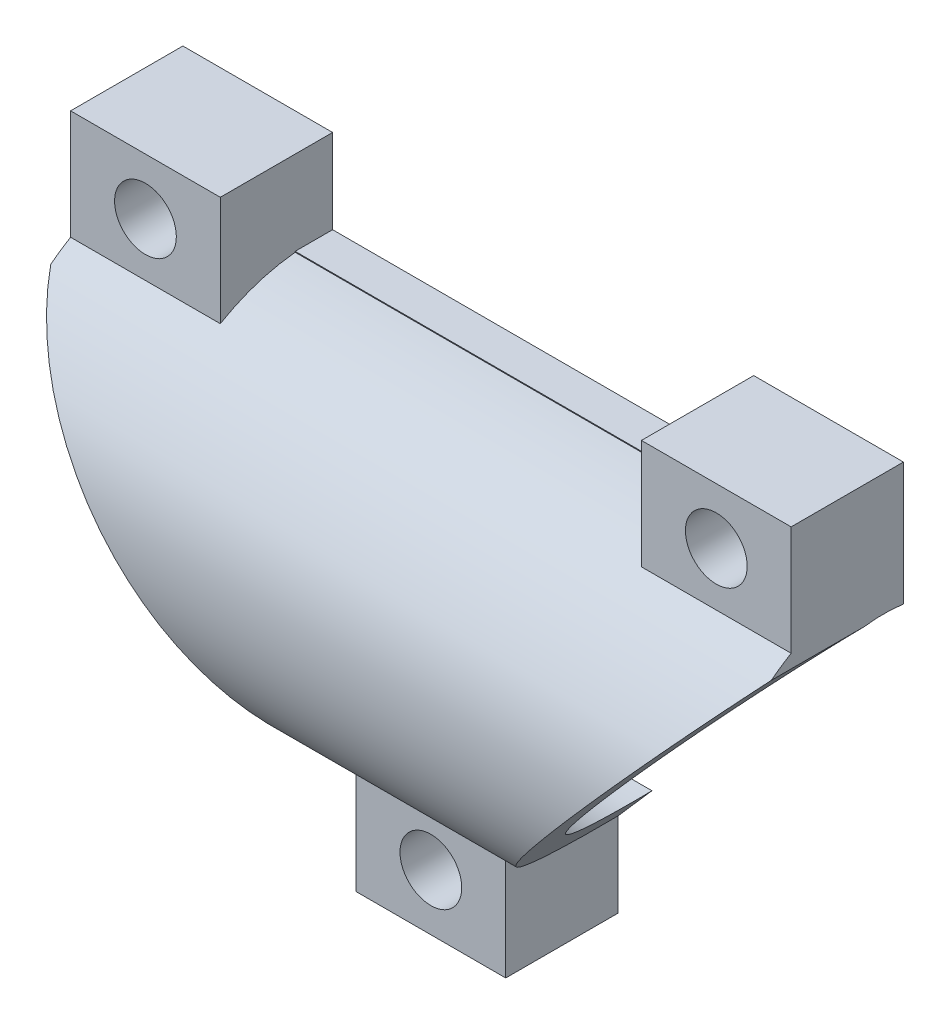
ISO-10303-21;
HEADER;
FILE_DESCRIPTION(('STEP AP214'),'2;1');
FILE_NAME('part.step','',(''),(''),'','','');
FILE_SCHEMA(('AUTOMOTIVE_DESIGN { 1 0 10303 214 1 1 1 1 }'));
ENDSEC;
DATA;
#1=APPLICATION_CONTEXT('core data for automotive mechanical design processes');
#2=APPLICATION_PROTOCOL_DEFINITION('international standard','automotive_design',2000,#1);
#3=PRODUCT_CONTEXT('',#1,'mechanical');
#4=PRODUCT('Part','Part','',(#3));
#5=PRODUCT_RELATED_PRODUCT_CATEGORY('part','',(#4));
#6=PRODUCT_DEFINITION_FORMATION('','',#4);
#7=PRODUCT_DEFINITION_CONTEXT('part definition',#1,'design');
#8=PRODUCT_DEFINITION('design','',#6,#7);
#9=PRODUCT_DEFINITION_SHAPE('','',#8);
#10=(LENGTH_UNIT() NAMED_UNIT(*) SI_UNIT(.MILLI.,.METRE.));
#11=(NAMED_UNIT(*) PLANE_ANGLE_UNIT() SI_UNIT($,.RADIAN.));
#12=(NAMED_UNIT(*) SI_UNIT($,.STERADIAN.) SOLID_ANGLE_UNIT());
#13=UNCERTAINTY_MEASURE_WITH_UNIT(LENGTH_MEASURE(1.E-05),#10,'distance_accuracy_value','');
#14=(GEOMETRIC_REPRESENTATION_CONTEXT(3) GLOBAL_UNCERTAINTY_ASSIGNED_CONTEXT((#13)) GLOBAL_UNIT_ASSIGNED_CONTEXT((#10,
#11,#12)) REPRESENTATION_CONTEXT('',''));
#15=CARTESIAN_POINT('',(0.,0.,0.));
#16=DIRECTION('',(0.,0.,1.));
#17=DIRECTION('',(1.,0.,0.));
#18=AXIS2_PLACEMENT_3D('',#15,#16,#17);
#19=CARTESIAN_POINT('',(37.343313249385,25.7499997086528,1.05000045748869));
#20=DIRECTION('',(-1.,0.,0.));
#21=DIRECTION('',(0.,0.,1.));
#22=AXIS2_PLACEMENT_3D('',#19,#20,#21);
#23=CYLINDRICAL_SURFACE('',#22,9.74999985625085);
#24=CARTESIAN_POINT('',(19.2499998956919,25.7499997086528,1.05000045748869));
#25=DIRECTION('',(-1.,0.,0.));
#26=DIRECTION('',(0.,0.,1.));
#27=AXIS2_PLACEMENT_3D('',#24,#25,#26);
#28=CIRCLE('',#27,9.74999985625085);
#29=CARTESIAN_POINT('',(19.2499998956919,33.4285423159599,7.05853444047162));
#30=VERTEX_POINT('',#29);
#31=CARTESIAN_POINT('',(19.2499998956919,34.1499998113926,6.));
#32=VERTEX_POINT('',#31);
#33=EDGE_CURVE('E382',#30,#32,#28,.T.);
#34=ORIENTED_EDGE('',*,*,#33,.T.);
#35=DIRECTION('',(-1.,0.,0.));
#36=VECTOR('',#35,1.);
#37=CARTESIAN_POINT('',(37.343313249385,34.1499998113926,6.));
#38=LINE('',#37,#36);
#39=CARTESIAN_POINT('',(11.2500004470348,34.1499998113926,6.));
#40=VERTEX_POINT('',#39);
#41=EDGE_CURVE('E48',#32,#40,#38,.T.);
#42=ORIENTED_EDGE('',*,*,#41,.T.);
#43=CARTESIAN_POINT('',(11.2500004470348,25.7499997086528,1.05000045748869));
#44=DIRECTION('',(1.,0.,0.));
#45=DIRECTION('',(0.,0.,-1.));
#46=AXIS2_PLACEMENT_3D('',#43,#44,#45);
#47=CIRCLE('',#46,9.74999985625085);
#48=CARTESIAN_POINT('',(11.2500004470348,35.4536071855719,2.));
#49=VERTEX_POINT('',#48);
#50=EDGE_CURVE('E52',#49,#40,#47,.T.);
#51=ORIENTED_EDGE('',*,*,#50,.F.);
#52=DIRECTION('',(-1.,0.,0.));
#53=VECTOR('',#52,1.);
#54=CARTESIAN_POINT('',(37.343313249385,35.4536071855719,2.));
#55=LINE('',#54,#53);
#56=CARTESIAN_POINT('',(-11.2500004470348,35.4536071855719,2.));
#57=VERTEX_POINT('',#56);
#58=EDGE_CURVE('E299',#49,#57,#55,.T.);
#59=ORIENTED_EDGE('',*,*,#58,.T.);
#60=CARTESIAN_POINT('',(-11.2500004470348,25.7499997086528,1.05000045748869));
#61=DIRECTION('',(-1.,0.,0.));
#62=DIRECTION('',(0.,0.,1.));
#63=AXIS2_PLACEMENT_3D('',#60,#61,#62);
#64=CIRCLE('',#63,9.74999985625085);
#65=CARTESIAN_POINT('',(-11.2500004470348,34.1499998113926,6.));
#66=VERTEX_POINT('',#65);
#67=EDGE_CURVE('E249',#66,#57,#64,.T.);
#68=ORIENTED_EDGE('',*,*,#67,.F.);
#69=DIRECTION('',(-1.,0.,0.));
#70=VECTOR('',#69,1.);
#71=CARTESIAN_POINT('',(37.343313249385,34.1499998113926,6.));
#72=LINE('',#71,#70);
#73=CARTESIAN_POINT('',(-19.2499998956919,34.1499998113926,6.));
#74=VERTEX_POINT('',#73);
#75=EDGE_CURVE('E244',#66,#74,#72,.T.);
#76=ORIENTED_EDGE('',*,*,#75,.T.);
#77=CARTESIAN_POINT('',(-19.2499998956919,25.7499997086528,1.05000045748869));
#78=DIRECTION('',(1.,0.,0.));
#79=DIRECTION('',(0.,0.,-1.));
#80=AXIS2_PLACEMENT_3D('',#77,#78,#79);
#81=CIRCLE('',#80,9.74999985625085);
#82=CARTESIAN_POINT('',(-19.2499998956919,33.4280635697985,7.05914619886155));
#83=VERTEX_POINT('',#82);
#84=EDGE_CURVE('E266',#74,#83,#81,.T.);
#85=ORIENTED_EDGE('',*,*,#84,.T.);
#86=CARTESIAN_POINT('',(-12.53149808052,25.7499997086528,1.05000045748869));
#87=DIRECTION('',(0.752567177216542,0.658515484841721,0.));
#88=DIRECTION('',(0.658515484841721,-0.752567177216542,0.));
#89=AXIS2_PLACEMENT_3D('',#86,#87,#88);
#90=ELLIPSE('',#89,12.9556538624397,9.74999985625085);
#91=CARTESIAN_POINT('',(-4.04059391165742,16.0463922317337,2.));
#92=VERTEX_POINT('',#91);
#93=EDGE_CURVE('E286',#92,#83,#90,.F.);
#94=ORIENTED_EDGE('',*,*,#93,.F.);
#95=DIRECTION('',(-1.,0.,0.));
#96=VECTOR('',#95,1.);
#97=CARTESIAN_POINT('',(37.343313249385,16.0463922317337,2.));
#98=LINE('',#97,#96);
#99=CARTESIAN_POINT('',(-4.00000018998981,16.0463922317337,2.));
#100=VERTEX_POINT('',#99);
#101=EDGE_CURVE('E304',#100,#92,#98,.T.);
#102=ORIENTED_EDGE('',*,*,#101,.F.);
#103=CARTESIAN_POINT('',(-4.00000018998981,25.7499997086528,1.05000045748869));
#104=DIRECTION('',(1.,0.,0.));
#105=DIRECTION('',(0.,0.,-1.));
#106=AXIS2_PLACEMENT_3D('',#103,#104,#105);
#107=CIRCLE('',#106,9.74999985625085);
#108=CARTESIAN_POINT('',(-4.00000018998981,17.349999605913,6.));
#109=VERTEX_POINT('',#108);
#110=EDGE_CURVE('E389',#109,#100,#107,.T.);
#111=ORIENTED_EDGE('',*,*,#110,.F.);
#112=DIRECTION('',(-1.,0.,0.));
#113=VECTOR('',#112,1.);
#114=CARTESIAN_POINT('',(37.343313249385,17.349999605913,6.));
#115=LINE('',#114,#113);
#116=CARTESIAN_POINT('',(4.00000018998981,17.349999605913,6.));
#117=VERTEX_POINT('',#116);
#118=EDGE_CURVE('E41',#109,#117,#115,.F.);
#119=ORIENTED_EDGE('',*,*,#118,.T.);
#120=CARTESIAN_POINT('',(4.00000018998981,25.7499997086528,1.05000045748869));
#121=DIRECTION('',(-1.,0.,0.));
#122=DIRECTION('',(0.,0.,1.));
#123=AXIS2_PLACEMENT_3D('',#120,#121,#122);
#124=CIRCLE('',#123,9.74999985625085);
#125=CARTESIAN_POINT('',(4.00000018998981,16.0463922317337,2.));
#126=VERTEX_POINT('',#125);
#127=EDGE_CURVE('E11',#126,#117,#124,.T.);
#128=ORIENTED_EDGE('',*,*,#127,.F.);
#129=CARTESIAN_POINT('',(4.04059279658486,16.0463922317337,2.));
#130=VERTEX_POINT('',#129);
#131=EDGE_CURVE('E293',#130,#126,#98,.T.);
#132=ORIENTED_EDGE('',*,*,#131,.F.);
#133=CARTESIAN_POINT('',(12.5312637280441,25.7499997086528,1.05000045748869));
#134=DIRECTION('',(-0.752576141659536,0.658505239922088,0.));
#135=DIRECTION('',(-0.658505239922088,-0.752576141659536,0.));
#136=AXIS2_PLACEMENT_3D('',#133,#134,#135);
#137=ELLIPSE('',#136,12.9554995388915,9.74999985625085);
#138=EDGE_CURVE('E292',#130,#30,#137,.T.);
#139=ORIENTED_EDGE('',*,*,#138,.T.);
#140=EDGE_LOOP('',(#34,#42,#51,#59,#68,#76,#85,#94,#102,#111,#119,#128,#132,#139));
#141=FACE_BOUND('',#140,.T.);
#142=ADVANCED_FACE('F33',(#141),#23,.T.);
#143=CARTESIAN_POINT('',(0.,0.,2.));
#144=DIRECTION('',(0.,0.,-1.));
#145=DIRECTION('',(-1.,0.,0.));
#146=AXIS2_PLACEMENT_3D('',#143,#144,#145);
#147=PLANE('',#146);
#148=DIRECTION('',(0.,-1.,0.));
#149=VECTOR('',#148,1.);
#150=CARTESIAN_POINT('',(11.2500004470348,39.9999991059303,2.));
#151=LINE('',#150,#149);
#152=CARTESIAN_POINT('',(11.2500004470348,35.5000011622906,2.));
#153=VERTEX_POINT('',#152);
#154=EDGE_CURVE('E214',#153,#49,#151,.T.);
#155=ORIENTED_EDGE('',*,*,#154,.F.);
#156=DIRECTION('',(-1.,0.,0.));
#157=VECTOR('',#156,1.);
#158=CARTESIAN_POINT('',(11.2500004470348,35.5000011622906,2.));
#159=LINE('',#158,#157);
#160=CARTESIAN_POINT('',(-11.2500004470348,35.5000011622906,2.));
#161=VERTEX_POINT('',#160);
#162=EDGE_CURVE('E329',#153,#161,#159,.T.);
#163=ORIENTED_EDGE('',*,*,#162,.T.);
#164=DIRECTION('',(0.,1.,0.));
#165=VECTOR('',#164,1.);
#166=CARTESIAN_POINT('',(-11.2500004470348,39.9999991059303,2.));
#167=LINE('',#166,#165);
#168=EDGE_CURVE('E246',#57,#161,#167,.T.);
#169=ORIENTED_EDGE('',*,*,#168,.F.);
#170=ORIENTED_EDGE('',*,*,#58,.F.);
#171=EDGE_LOOP('',(#155,#163,#169,#170));
#172=FACE_BOUND('',#171,.T.);
#173=ADVANCED_FACE('F414',(#172),#147,.F.);
#174=CARTESIAN_POINT('',(15.8254704476873,35.4536071855719,2.));
#175=VERTEX_POINT('',#174);
#176=CARTESIAN_POINT('',(14.6745273094585,35.4536071855719,2.));
#177=VERTEX_POINT('',#176);
#178=EDGE_CURVE('E300',#175,#177,#55,.T.);
#179=ORIENTED_EDGE('',*,*,#178,.T.);
#180=CARTESIAN_POINT('',(14.6745273094585,35.4536071855719,2.));
#181=CARTESIAN_POINT('',(14.6890869193746,35.4482353639984,2.05497857071875));
#182=CARTESIAN_POINT('',(14.7052699945459,35.4424044633526,2.10961388611764));
#183=CARTESIAN_POINT('',(14.7424330877981,35.4298693754148,2.21860863914415));
#184=CARTESIAN_POINT('',(14.7635200995631,35.4231474127118,2.27292912308935));
#185=CARTESIAN_POINT('',(14.8115325915728,35.4091295544325,2.37913638152385));
#186=CARTESIAN_POINT('',(14.8384790305994,35.4018316600828,2.4310135844776));
#187=CARTESIAN_POINT('',(14.9001365528176,35.3872044383898,2.52959112685936));
#188=CARTESIAN_POINT('',(14.9347603772952,35.3798763075888,2.57634145054614));
#189=CARTESIAN_POINT('',(14.9894105139679,35.3706440791198,2.63301801505737));
#190=CARTESIAN_POINT('',(15.0046732050333,35.3682601192811,2.64742137543305));
#191=CARTESIAN_POINT('',(15.0368475830146,35.363744945726,2.67437213859106));
#192=CARTESIAN_POINT('',(15.0537609441431,35.3616139935834,2.68691762385244));
#193=CARTESIAN_POINT('',(15.089493952645,35.3577265449485,2.70958381325525));
#194=CARTESIAN_POINT('',(15.108333379187,35.3559746626832,2.71967480560363));
#195=CARTESIAN_POINT('',(15.1475582701478,35.3530674054866,2.73631615995588));
#196=CARTESIAN_POINT('',(15.1679397208053,35.3519105391594,2.74287537624275));
#197=CARTESIAN_POINT('',(15.204926103075,35.3505371496644,2.7506443950677));
#198=CARTESIAN_POINT('',(15.2213415005125,35.3501670419555,2.75272903255858));
#199=CARTESIAN_POINT('',(15.2542928049548,35.3499241328895,2.75409816267267));
#200=CARTESIAN_POINT('',(15.2708286713276,35.350051170961,2.75338355941361));
#201=CARTESIAN_POINT('',(15.3034946928646,35.3507871871223,2.74922999291914));
#202=CARTESIAN_POINT('',(15.3196257233044,35.3513950125314,2.74579754565613));
#203=CARTESIAN_POINT('',(15.3511522738661,35.3530282597933,2.73652404962179));
#204=CARTESIAN_POINT('',(15.3665472309216,35.3540539957959,2.73068118886449));
#205=CARTESIAN_POINT('',(15.4033372354835,35.3569945167403,2.71380637878747));
#206=CARTESIAN_POINT('',(15.4241871216667,35.3591008689789,2.70162506826086));
#207=CARTESIAN_POINT('',(15.4636903406001,35.3637751915386,2.67419671624534));
#208=CARTESIAN_POINT('',(15.4823383288106,35.3663442483119,2.65894244909774));
#209=CARTESIAN_POINT('',(15.5301200857362,35.3736647363941,2.61472356264629));
#210=CARTESIAN_POINT('',(15.5573007250368,35.3786708135981,2.58371306789918));
#211=CARTESIAN_POINT('',(15.6070712551038,35.3888998986343,2.51806821788299));
#212=CARTESIAN_POINT('',(15.6296278373143,35.3941241749943,2.48341011687443));
#213=CARTESIAN_POINT('',(15.6707385864821,35.4044070138463,2.41241991648163));
#214=CARTESIAN_POINT('',(15.6893412901131,35.4094668504486,2.3761156759667));
#215=CARTESIAN_POINT('',(15.7236421608923,35.4193425670659,2.3020808823343));
#216=CARTESIAN_POINT('',(15.739335649073,35.4241580451939,2.26434814709082));
#217=CARTESIAN_POINT('',(15.7678457523684,35.4332993497926,2.18912062181814));
#218=CARTESIAN_POINT('',(15.7807365677551,35.4376357376829,2.15165482568203));
#219=CARTESIAN_POINT('',(15.8045103240348,35.4459196077647,2.07619672380728));
#220=CARTESIAN_POINT('',(15.8154003628682,35.449868440663,2.03820681431734));
#221=CARTESIAN_POINT('',(15.8254704476873,35.4536071855719,2.));
#222=B_SPLINE_CURVE_WITH_KNOTS('',3,(#180,#181,#182,#183,#184,#185,#186,#187,#188,#189,#190,
#191,#192,#193,#194,#195,#196,#197,#198,#199,#200,#201,#202,#203,#204,#205,#206,#207,#208,#209,
#210,#211,#212,#213,#214,#215,#216,#217,#218,#219,#220,#221),.UNSPECIFIED.,.F.,.F.,(4,2,2,2,2,2,
2,2,2,2,2,2,2,2,2,2,2,2,2,2,4),(0.,0.171556884118197,0.347281912473263,0.523646151863211,
0.698100216558771,0.761350463593841,0.824665543201889,0.888712657656493,0.952598447227425,
1.00202228833746,1.05143016751675,1.10071994972591,1.15004685237581,1.22234883758516,
1.29482285870243,1.41874247962986,1.54352558539148,1.66667491143804,1.7900206152079,
1.90953620828261,2.0286192572141),.UNSPECIFIED.);
#223=EDGE_CURVE('E209',#177,#175,#222,.T.);
#224=ORIENTED_EDGE('',*,*,#223,.T.);
#225=EDGE_LOOP('',(#179,#224));
#226=FACE_BOUND('',#225,.T.);
#227=ADVANCED_FACE('F415',(#226),#23,.T.);
#228=DIRECTION('',(0.,1.,0.));
#229=VECTOR('',#228,1.);
#230=CARTESIAN_POINT('',(4.00000018998981,11.5000000223517,2.));
#231=LINE('',#230,#229);
#232=CARTESIAN_POINT('',(4.00000018998981,16.0000007599592,2.));
#233=VERTEX_POINT('',#232);
#234=EDGE_CURVE('E255',#233,#126,#231,.T.);
#235=ORIENTED_EDGE('',*,*,#234,.F.);
#236=DIRECTION('',(0.658505239922087,0.752576141659536,0.));
#237=VECTOR('',#236,1.);
#238=CARTESIAN_POINT('',(19.2499998956919,33.4285423159599,2.));
#239=LINE('',#238,#237);
#240=EDGE_CURVE('E325',#233,#130,#239,.T.);
#241=ORIENTED_EDGE('',*,*,#240,.T.);
#242=ORIENTED_EDGE('',*,*,#131,.T.);
#243=EDGE_LOOP('',(#235,#241,#242));
#244=FACE_BOUND('',#243,.T.);
#245=ADVANCED_FACE('F422',(#244),#147,.F.);
#246=DIRECTION('',(0.,-1.,0.));
#247=VECTOR('',#246,1.);
#248=CARTESIAN_POINT('',(-4.00000018998981,11.5000000223517,2.));
#249=LINE('',#248,#247);
#250=CARTESIAN_POINT('',(-4.00000018998981,16.0000007599592,2.));
#251=VERTEX_POINT('',#250);
#252=EDGE_CURVE('E260',#100,#251,#249,.T.);
#253=ORIENTED_EDGE('',*,*,#252,.F.);
#254=ORIENTED_EDGE('',*,*,#101,.T.);
#255=DIRECTION('',(0.658515484841721,-0.752567177216542,0.));
#256=VECTOR('',#255,1.);
#257=CARTESIAN_POINT('',(-19.2499998956919,33.4280635697985,2.));
#258=LINE('',#257,#256);
#259=EDGE_CURVE('E323',#92,#251,#258,.T.);
#260=ORIENTED_EDGE('',*,*,#259,.T.);
#261=EDGE_LOOP('',(#253,#254,#260));
#262=FACE_BOUND('',#261,.T.);
#263=ADVANCED_FACE('F421',(#262),#147,.F.);
#264=CARTESIAN_POINT('',(-14.6745279139533,35.4536071855719,2.));
#265=VERTEX_POINT('',#264);
#266=CARTESIAN_POINT('',(-15.8254710919479,35.4536071855719,2.));
#267=VERTEX_POINT('',#266);
#268=EDGE_CURVE('E289',#265,#267,#55,.T.);
#269=ORIENTED_EDGE('',*,*,#268,.T.);
#270=CARTESIAN_POINT('',(-15.8254710919479,35.4536071855719,2.));
#271=CARTESIAN_POINT('',(-15.8109114806375,35.4482353633008,2.05497857789963));
#272=CARTESIAN_POINT('',(-15.7947284037572,35.4424044618253,2.10961390046263));
#273=CARTESIAN_POINT('',(-15.7575653057898,35.429869371933,2.2186086683485));
#274=CARTESIAN_POINT('',(-15.7364782909346,35.4231474080908,2.27292915995856));
#275=CARTESIAN_POINT('',(-15.6884657910858,35.4091295473877,2.379136433025));
#276=CARTESIAN_POINT('',(-15.6615193472958,35.4018316517522,2.431013642939));
#277=CARTESIAN_POINT('',(-15.5998618130471,35.3872044276299,2.52959119712543));
#278=CARTESIAN_POINT('',(-15.5652379813819,35.3798762956855,2.57634152570385));
#279=CARTESIAN_POINT('',(-15.5105878350755,35.3706440667171,2.63301809041545));
#280=CARTESIAN_POINT('',(-15.4953251435036,35.3682601071184,2.64742144864683));
#281=CARTESIAN_POINT('',(-15.4631507646186,35.3637449341175,2.6743722072757));
#282=CARTESIAN_POINT('',(-15.4462374030931,35.3616139822891,2.68691769015237));
#283=CARTESIAN_POINT('',(-15.4105043940266,35.3577265343636,2.70958387451583));
#284=CARTESIAN_POINT('',(-15.3916649673196,35.3559746524947,2.71967486420649));
#285=CARTESIAN_POINT('',(-15.3524400764702,35.3530673961503,2.73631621310952));
#286=CARTESIAN_POINT('',(-15.3320586260873,35.3519105302793,2.74287542660369));
#287=CARTESIAN_POINT('',(-15.2950722436461,35.3505371415456,2.75064444089647));
#288=CARTESIAN_POINT('',(-15.2786568455997,35.3501670341765,2.75272907641642));
#289=CARTESIAN_POINT('',(-15.2457055402925,35.3499241258203,2.75409820249579));
#290=CARTESIAN_POINT('',(-15.2291696736636,35.3500511642619,2.75338359717154));
#291=CARTESIAN_POINT('',(-15.1965036520055,35.3507871811497,2.74923002666758));
#292=CARTESIAN_POINT('',(-15.1803726216988,35.3513950069135,2.7457975774689));
#293=CARTESIAN_POINT('',(-15.1488460716281,35.3530282548425,2.73652407781704));
#294=CARTESIAN_POINT('',(-15.1334511149305,35.3540539911572,2.73068121537846));
#295=CARTESIAN_POINT('',(-15.0966611084379,35.356994513043,2.71380640015804));
#296=CARTESIAN_POINT('',(-15.075811220299,35.3591008659778,2.70162508575457));
#297=CARTESIAN_POINT('',(-15.0363079980231,35.3637751899307,2.6741967257976));
#298=CARTESIAN_POINT('',(-15.0176600084291,35.3663442474016,2.65894245458245));
#299=CARTESIAN_POINT('',(-14.9698782462994,35.3736647376266,2.61472355522571));
#300=CARTESIAN_POINT('',(-14.9426976039499,35.3786708162901,2.58371305120111));
#301=CARTESIAN_POINT('',(-14.892927069006,35.3888999040725,2.51806818239576));
#302=CARTESIAN_POINT('',(-14.8703704849685,35.3941241817176,2.48341007187932));
#303=CARTESIAN_POINT('',(-14.8292597403943,35.4044070210549,2.41241986531173));
#304=CARTESIAN_POINT('',(-14.8106570418556,35.4094668568947,2.37611562888716));
#305=CARTESIAN_POINT('',(-14.776356179987,35.4193425719786,2.30208084425702));
#306=CARTESIAN_POINT('',(-14.7606626956182,35.4241580493358,2.26434811392872));
#307=CARTESIAN_POINT('',(-14.7321525986648,35.4332993525501,2.18912059823125));
#308=CARTESIAN_POINT('',(-14.7192617858716,35.4376357398198,2.15165480672803));
#309=CARTESIAN_POINT('',(-14.695488034066,35.4459196087585,2.07619671424183));
#310=CARTESIAN_POINT('',(-14.6845979971219,35.4498684411329,2.03820680950446));
#311=CARTESIAN_POINT('',(-14.6745279139533,35.4536071855719,2.));
#312=B_SPLINE_CURVE_WITH_KNOTS('',3,(#270,#271,#272,#273,#274,#275,#276,#277,#278,#279,#280,
#281,#282,#283,#284,#285,#286,#287,#288,#289,#290,#291,#292,#293,#294,#295,#296,#297,#298,#299,
#300,#301,#302,#303,#304,#305,#306,#307,#308,#309,#310,#311),.UNSPECIFIED.,.F.,.F.,(4,2,2,2,2,2,
2,2,2,2,2,2,2,2,2,2,2,2,2,2,4),(0.,0.171556906210703,0.347281959483287,0.523646224140955,
0.698100312736243,0.761350556381208,0.824665632582758,0.888712743597544,0.952598529765746,
1.00202237189821,1.05143025212526,1.10072003521839,1.15004693874504,1.22234893495675,
1.29482296716301,1.41874261523071,1.54352574812807,1.66667505630267,1.79002074198567,
1.90953631931055,2.02861935293385),.UNSPECIFIED.);
#313=EDGE_CURVE('E238',#267,#265,#312,.T.);
#314=ORIENTED_EDGE('',*,*,#313,.T.);
#315=EDGE_LOOP('',(#269,#314));
#316=FACE_BOUND('',#315,.T.);
#317=ADVANCED_FACE('F425',(#316),#23,.T.);
#318=CARTESIAN_POINT('',(0.,0.,0.));
#319=DIRECTION('',(0.,0.,-1.));
#320=DIRECTION('',(-1.,0.,0.));
#321=AXIS2_PLACEMENT_3D('',#318,#319,#320);
#322=PLANE('',#321);
#323=DIRECTION('',(1.,0.,0.));
#324=VECTOR('',#323,1.);
#325=CARTESIAN_POINT('',(-61.2500004470348,33.4285410291877,0.));
#326=LINE('',#325,#324);
#327=CARTESIAN_POINT('',(-19.2499998956919,33.4285410291877,0.));
#328=VERTEX_POINT('',#327);
#329=CARTESIAN_POINT('',(19.2499998956919,33.4285423159599,0.));
#330=VERTEX_POINT('',#329);
#331=EDGE_CURVE('E277',#328,#330,#326,.T.);
#332=ORIENTED_EDGE('',*,*,#331,.F.);
#333=DIRECTION('',(0.,-1.,0.));
#334=VECTOR('',#333,1.);
#335=CARTESIAN_POINT('',(-19.2499998956919,35.5000011622906,0.));
#336=LINE('',#335,#334);
#337=CARTESIAN_POINT('',(-19.2499998956919,39.9999991059303,0.));
#338=VERTEX_POINT('',#337);
#339=EDGE_CURVE('E320',#338,#328,#336,.T.);
#340=ORIENTED_EDGE('',*,*,#339,.F.);
#341=DIRECTION('',(-1.,0.,0.));
#342=VECTOR('',#341,1.);
#343=CARTESIAN_POINT('',(-19.2499998956919,39.9999991059303,0.));
#344=LINE('',#343,#342);
#345=CARTESIAN_POINT('',(-11.2500004470348,39.9999991059303,0.));
#346=VERTEX_POINT('',#345);
#347=EDGE_CURVE('E326',#346,#338,#344,.T.);
#348=ORIENTED_EDGE('',*,*,#347,.F.);
#349=DIRECTION('',(0.,1.,0.));
#350=VECTOR('',#349,1.);
#351=CARTESIAN_POINT('',(-11.2500004470348,39.9999991059303,0.));
#352=LINE('',#351,#350);
#353=CARTESIAN_POINT('',(-11.2500004470348,35.5000011622906,0.));
#354=VERTEX_POINT('',#353);
#355=EDGE_CURVE('E352',#354,#346,#352,.T.);
#356=ORIENTED_EDGE('',*,*,#355,.F.);
#357=DIRECTION('',(-1.,0.,0.));
#358=VECTOR('',#357,1.);
#359=CARTESIAN_POINT('',(11.2500004470348,35.5000011622906,0.));
#360=LINE('',#359,#358);
#361=CARTESIAN_POINT('',(11.2500004470348,35.5000011622906,0.));
#362=VERTEX_POINT('',#361);
#363=EDGE_CURVE('E350',#362,#354,#360,.T.);
#364=ORIENTED_EDGE('',*,*,#363,.F.);
#365=DIRECTION('',(0.,-1.,0.));
#366=VECTOR('',#365,1.);
#367=CARTESIAN_POINT('',(11.2500004470348,39.9999991059303,0.));
#368=LINE('',#367,#366);
#369=CARTESIAN_POINT('',(11.2500004470348,39.9999991059303,0.));
#370=VERTEX_POINT('',#369);
#371=EDGE_CURVE('E348',#370,#362,#368,.T.);
#372=ORIENTED_EDGE('',*,*,#371,.F.);
#373=DIRECTION('',(-1.,0.,0.));
#374=VECTOR('',#373,1.);
#375=CARTESIAN_POINT('',(19.2499998956919,39.9999991059303,0.));
#376=LINE('',#375,#374);
#377=CARTESIAN_POINT('',(19.2499998956919,39.9999991059303,0.));
#378=VERTEX_POINT('',#377);
#379=EDGE_CURVE('E346',#378,#370,#376,.T.);
#380=ORIENTED_EDGE('',*,*,#379,.F.);
#381=DIRECTION('',(0.,1.,0.));
#382=VECTOR('',#381,1.);
#383=CARTESIAN_POINT('',(19.2499998956919,39.9999991059303,0.));
#384=LINE('',#383,#382);
#385=EDGE_CURVE('E192',#330,#378,#384,.T.);
#386=ORIENTED_EDGE('',*,*,#385,.F.);
#387=EDGE_LOOP('',(#332,#340,#348,#356,#364,#372,#380,#386));
#388=FACE_BOUND('',#387,.T.);
#389=CARTESIAN_POINT('',(-15.2499995029506,37.0000014711159,0.));
#390=DIRECTION('',(0.,0.,1.));
#391=DIRECTION('',(1.,0.,0.));
#392=AXIS2_PLACEMENT_3D('',#389,#390,#391);
#393=CIRCLE('',#392,1.65000085942588);
#394=CARTESIAN_POINT('',(-13.5999986435247,37.0000014711159,0.));
#395=VERTEX_POINT('',#394);
#396=EDGE_CURVE('E314',#395,#395,#393,.T.);
#397=ORIENTED_EDGE('',*,*,#396,.T.);
#398=EDGE_LOOP('',(#397));
#399=FACE_BOUND('',#398,.T.);
#400=CARTESIAN_POINT('',(15.2499988785729,37.0000014746957,0.));
#401=DIRECTION('',(0.,0.,1.));
#402=DIRECTION('',(1.,0.,0.));
#403=AXIS2_PLACEMENT_3D('',#400,#401,#402);
#404=CIRCLE('',#403,1.65000085584639);
#405=CARTESIAN_POINT('',(16.8999997344193,37.0000014746957,0.));
#406=VERTEX_POINT('',#405);
#407=EDGE_CURVE('E308',#406,#406,#404,.T.);
#408=ORIENTED_EDGE('',*,*,#407,.T.);
#409=EDGE_LOOP('',(#408));
#410=FACE_BOUND('',#409,.T.);
#411=ADVANCED_FACE('F432',(#388,#399,#410),#322,.T.);
#412=DIRECTION('',(1.,0.,0.));
#413=VECTOR('',#412,1.);
#414=CARTESIAN_POINT('',(-61.2500004470348,18.0714583881179,0.));
#415=LINE('',#414,#413);
#416=CARTESIAN_POINT('',(5.8125286863239,18.0714583881179,0.));
#417=VERTEX_POINT('',#416);
#418=CARTESIAN_POINT('',(-5.81257847619841,18.0714583881179,0.));
#419=VERTEX_POINT('',#418);
#420=EDGE_CURVE('E284',#417,#419,#415,.F.);
#421=ORIENTED_EDGE('',*,*,#420,.F.);
#422=DIRECTION('',(0.658505239922087,0.752576141659536,0.));
#423=VECTOR('',#422,1.);
#424=CARTESIAN_POINT('',(19.2499998956919,33.4285423159599,0.));
#425=LINE('',#424,#423);
#426=CARTESIAN_POINT('',(4.00000018998981,16.0000007599592,0.));
#427=VERTEX_POINT('',#426);
#428=EDGE_CURVE('E342',#427,#417,#425,.T.);
#429=ORIENTED_EDGE('',*,*,#428,.F.);
#430=DIRECTION('',(0.,1.,0.));
#431=VECTOR('',#430,1.);
#432=CARTESIAN_POINT('',(4.00000018998981,11.5000000223517,0.));
#433=LINE('',#432,#431);
#434=CARTESIAN_POINT('',(4.00000018998981,11.5000000223517,0.));
#435=VERTEX_POINT('',#434);
#436=EDGE_CURVE('E340',#435,#427,#433,.T.);
#437=ORIENTED_EDGE('',*,*,#436,.F.);
#438=DIRECTION('',(1.,0.,0.));
#439=VECTOR('',#438,1.);
#440=CARTESIAN_POINT('',(4.00000018998981,11.5000000223517,0.));
#441=LINE('',#440,#439);
#442=CARTESIAN_POINT('',(-4.00000018998981,11.5000000223517,0.));
#443=VERTEX_POINT('',#442);
#444=EDGE_CURVE('E338',#443,#435,#441,.T.);
#445=ORIENTED_EDGE('',*,*,#444,.F.);
#446=DIRECTION('',(0.,-1.,0.));
#447=VECTOR('',#446,1.);
#448=CARTESIAN_POINT('',(-4.00000018998981,11.5000000223517,0.));
#449=LINE('',#448,#447);
#450=CARTESIAN_POINT('',(-4.00000018998981,16.0000007599592,0.));
#451=VERTEX_POINT('',#450);
#452=EDGE_CURVE('E336',#451,#443,#449,.T.);
#453=ORIENTED_EDGE('',*,*,#452,.F.);
#454=DIRECTION('',(0.658515484841721,-0.752567177216542,0.));
#455=VECTOR('',#454,1.);
#456=CARTESIAN_POINT('',(-19.2499998956919,33.4280635697985,0.));
#457=LINE('',#456,#455);
#458=EDGE_CURVE('E334',#419,#451,#457,.T.);
#459=ORIENTED_EDGE('',*,*,#458,.F.);
#460=EDGE_LOOP('',(#421,#429,#437,#445,#453,#459));
#461=FACE_BOUND('',#460,.T.);
#462=CARTESIAN_POINT('',(1.86598644064687E-07,14.4999997791263,0.));
#463=DIRECTION('',(0.,0.,1.));
#464=DIRECTION('',(1.,0.,0.));
#465=AXIS2_PLACEMENT_3D('',#462,#463,#464);
#466=CIRCLE('',#465,1.64999979470053);
#467=CARTESIAN_POINT('',(1.64999998129917,14.4999997791263,0.));
#468=VERTEX_POINT('',#467);
#469=EDGE_CURVE('E296',#468,#468,#466,.T.);
#470=ORIENTED_EDGE('',*,*,#469,.T.);
#471=EDGE_LOOP('',(#470));
#472=FACE_BOUND('',#471,.T.);
#473=ADVANCED_FACE('F438',(#461,#472),#322,.T.);
#474=CARTESIAN_POINT('',(-19.2499998956919,35.5000011622906,2.));
#475=DIRECTION('',(1.,0.,0.));
#476=DIRECTION('',(0.,1.,0.));
#477=AXIS2_PLACEMENT_3D('',#474,#475,#476);
#478=PLANE('',#477);
#479=ORIENTED_EDGE('',*,*,#84,.F.);
#480=DIRECTION('',(0.,-1.,0.));
#481=VECTOR('',#480,1.);
#482=CARTESIAN_POINT('',(-19.2499998956919,39.9999991059303,6.));
#483=LINE('',#482,#481);
#484=CARTESIAN_POINT('',(-19.2499998956919,39.9999991059303,6.));
#485=VERTEX_POINT('',#484);
#486=EDGE_CURVE('E459',#485,#74,#483,.T.);
#487=ORIENTED_EDGE('',*,*,#486,.F.);
#488=DIRECTION('',(0.,0.,-1.));
#489=VECTOR('',#488,1.);
#490=CARTESIAN_POINT('',(-19.2499998956919,39.9999991059303,2.));
#491=LINE('',#490,#489);
#492=EDGE_CURVE('E331',#485,#338,#491,.T.);
#493=ORIENTED_EDGE('',*,*,#492,.T.);
#494=ORIENTED_EDGE('',*,*,#339,.T.);
#495=CARTESIAN_POINT('',(-19.2499998956919,25.7499997086528,1.05000045748869));
#496=DIRECTION('',(1.,0.,0.));
#497=DIRECTION('',(0.,1.,0.));
#498=AXIS2_PLACEMENT_3D('',#495,#496,#497);
#499=CIRCLE('',#498,7.74999985625085);
#500=CARTESIAN_POINT('',(-19.2499998956919,33.4280635697985,2.10348663018204));
#501=VERTEX_POINT('',#500);
#502=EDGE_CURVE('E275',#328,#501,#499,.T.);
#503=ORIENTED_EDGE('',*,*,#502,.T.);
#504=DIRECTION('',(0.,0.,-1.));
#505=VECTOR('',#504,1.);
#506=CARTESIAN_POINT('',(-19.2499998956919,33.4280635697985,2.));
#507=LINE('',#506,#505);
#508=EDGE_CURVE('E379',#83,#501,#507,.T.);
#509=ORIENTED_EDGE('',*,*,#508,.F.);
#510=EDGE_LOOP('',(#479,#487,#493,#494,#503,#509));
#511=FACE_BOUND('',#510,.T.);
#512=ADVANCED_FACE('F35',(#511),#478,.F.);
#513=CARTESIAN_POINT('',(-19.2499998956919,33.4280635697985,2.));
#514=DIRECTION('',(0.752567177216542,0.658515484841721,0.));
#515=DIRECTION('',(-0.658515484841721,0.752567177216542,0.));
#516=AXIS2_PLACEMENT_3D('',#513,#514,#515);
#517=PLANE('',#516);
#518=ORIENTED_EDGE('',*,*,#259,.F.);
#519=ORIENTED_EDGE('',*,*,#93,.T.);
#520=ORIENTED_EDGE('',*,*,#508,.T.);
#521=CARTESIAN_POINT('',(-12.53149808052,25.7499997086528,1.05000045748869));
#522=DIRECTION('',(0.752567177216542,0.658515484841721,0.));
#523=DIRECTION('',(0.658515484841721,-0.752567177216542,0.));
#524=AXIS2_PLACEMENT_3D('',#521,#522,#523);
#525=ELLIPSE('',#524,10.2980838001933,7.74999985625085);
#526=EDGE_CURVE('E281',#501,#419,#525,.T.);
#527=ORIENTED_EDGE('',*,*,#526,.T.);
#528=ORIENTED_EDGE('',*,*,#458,.T.);
#529=DIRECTION('',(0.,0.,-1.));
#530=VECTOR('',#529,1.);
#531=CARTESIAN_POINT('',(-4.00000018998981,16.0000007599592,2.));
#532=LINE('',#531,#530);
#533=EDGE_CURVE('E376',#251,#451,#532,.T.);
#534=ORIENTED_EDGE('',*,*,#533,.F.);
#535=EDGE_LOOP('',(#518,#519,#520,#527,#528,#534));
#536=FACE_BOUND('',#535,.T.);
#537=ADVANCED_FACE('F478',(#536),#517,.F.);
#538=CARTESIAN_POINT('',(-4.00000018998981,11.5000000223517,2.));
#539=DIRECTION('',(1.,0.,0.));
#540=DIRECTION('',(0.,0.,-1.));
#541=AXIS2_PLACEMENT_3D('',#538,#539,#540);
#542=PLANE('',#541);
#543=ORIENTED_EDGE('',*,*,#452,.T.);
#544=DIRECTION('',(0.,0.,-1.));
#545=VECTOR('',#544,1.);
#546=CARTESIAN_POINT('',(-4.00000018998981,11.5000000223517,2.));
#547=LINE('',#546,#545);
#548=CARTESIAN_POINT('',(-4.00000018998981,11.5000000223517,6.));
#549=VERTEX_POINT('',#548);
#550=EDGE_CURVE('E373',#549,#443,#547,.T.);
#551=ORIENTED_EDGE('',*,*,#550,.F.);
#552=DIRECTION('',(0.,-1.,0.));
#553=VECTOR('',#552,1.);
#554=CARTESIAN_POINT('',(-4.00000018998981,11.5000000223517,6.));
#555=LINE('',#554,#553);
#556=EDGE_CURVE('E259',#109,#549,#555,.T.);
#557=ORIENTED_EDGE('',*,*,#556,.F.);
#558=ORIENTED_EDGE('',*,*,#110,.T.);
#559=ORIENTED_EDGE('',*,*,#252,.T.);
#560=ORIENTED_EDGE('',*,*,#533,.T.);
#561=EDGE_LOOP('',(#543,#551,#557,#558,#559,#560));
#562=FACE_BOUND('',#561,.T.);
#563=ADVANCED_FACE('F505',(#562),#542,.F.);
#564=CARTESIAN_POINT('',(4.00000018998981,11.5000000223517,2.));
#565=DIRECTION('',(0.,1.,0.));
#566=DIRECTION('',(0.,0.,1.));
#567=AXIS2_PLACEMENT_3D('',#564,#565,#566);
#568=PLANE('',#567);
#569=ORIENTED_EDGE('',*,*,#444,.T.);
#570=DIRECTION('',(0.,0.,-1.));
#571=VECTOR('',#570,1.);
#572=CARTESIAN_POINT('',(4.00000018998981,11.5000000223517,2.));
#573=LINE('',#572,#571);
#574=CARTESIAN_POINT('',(4.00000018998981,11.5000000223517,6.));
#575=VERTEX_POINT('',#574);
#576=EDGE_CURVE('E370',#575,#435,#573,.T.);
#577=ORIENTED_EDGE('',*,*,#576,.F.);
#578=DIRECTION('',(1.,0.,0.));
#579=VECTOR('',#578,1.);
#580=CARTESIAN_POINT('',(4.00000018998981,11.5000000223517,6.));
#581=LINE('',#580,#579);
#582=EDGE_CURVE('E263',#549,#575,#581,.T.);
#583=ORIENTED_EDGE('',*,*,#582,.F.);
#584=ORIENTED_EDGE('',*,*,#550,.T.);
#585=EDGE_LOOP('',(#569,#577,#583,#584));
#586=FACE_BOUND('',#585,.T.);
#587=ADVANCED_FACE('F509',(#586),#568,.F.);
#588=CARTESIAN_POINT('',(4.00000018998981,11.5000000223517,2.));
#589=DIRECTION('',(-1.,0.,0.));
#590=DIRECTION('',(0.,0.,1.));
#591=AXIS2_PLACEMENT_3D('',#588,#589,#590);
#592=PLANE('',#591);
#593=ORIENTED_EDGE('',*,*,#436,.T.);
#594=DIRECTION('',(0.,0.,-1.));
#595=VECTOR('',#594,1.);
#596=CARTESIAN_POINT('',(4.00000018998981,16.0000007599592,2.));
#597=LINE('',#596,#595);
#598=EDGE_CURVE('E196',#233,#427,#597,.T.);
#599=ORIENTED_EDGE('',*,*,#598,.F.);
#600=ORIENTED_EDGE('',*,*,#234,.T.);
#601=ORIENTED_EDGE('',*,*,#127,.T.);
#602=DIRECTION('',(0.,1.,0.));
#603=VECTOR('',#602,1.);
#604=CARTESIAN_POINT('',(4.00000018998981,11.5000000223517,6.));
#605=LINE('',#604,#603);
#606=EDGE_CURVE('E256',#575,#117,#605,.T.);
#607=ORIENTED_EDGE('',*,*,#606,.F.);
#608=ORIENTED_EDGE('',*,*,#576,.T.);
#609=EDGE_LOOP('',(#593,#599,#600,#601,#607,#608));
#610=FACE_BOUND('',#609,.T.);
#611=ADVANCED_FACE('F514',(#610),#592,.F.);
#612=CARTESIAN_POINT('',(19.2499998956919,33.4285423159599,2.));
#613=DIRECTION('',(-0.752576141659536,0.658505239922088,0.));
#614=DIRECTION('',(-0.658505239922088,-0.752576141659536,0.));
#615=AXIS2_PLACEMENT_3D('',#612,#613,#614);
#616=PLANE('',#615);
#617=CARTESIAN_POINT('',(12.5312637280441,25.7499997086528,1.05000045748869));
#618=DIRECTION('',(-0.752576141659536,0.658505239922088,0.));
#619=DIRECTION('',(-0.658505239922088,-0.752576141659536,0.));
#620=AXIS2_PLACEMENT_3D('',#617,#618,#619);
#621=ELLIPSE('',#620,10.2979611327579,7.74999985625084);
#622=CARTESIAN_POINT('',(19.2499998956919,33.4285423159599,2.0999915049063));
#623=VERTEX_POINT('',#622);
#624=EDGE_CURVE('E290',#623,#417,#621,.F.);
#625=ORIENTED_EDGE('',*,*,#624,.F.);
#626=DIRECTION('',(0.,0.,1.));
#627=VECTOR('',#626,1.);
#628=CARTESIAN_POINT('',(19.2499998956919,33.4285423159599,2.));
#629=LINE('',#628,#627);
#630=EDGE_CURVE('E272',#623,#30,#629,.T.);
#631=ORIENTED_EDGE('',*,*,#630,.T.);
#632=ORIENTED_EDGE('',*,*,#138,.F.);
#633=ORIENTED_EDGE('',*,*,#240,.F.);
#634=ORIENTED_EDGE('',*,*,#598,.T.);
#635=ORIENTED_EDGE('',*,*,#428,.T.);
#636=EDGE_LOOP('',(#625,#631,#632,#633,#634,#635));
#637=FACE_BOUND('',#636,.T.);
#638=ADVANCED_FACE('F521',(#637),#616,.F.);
#639=CARTESIAN_POINT('',(19.2499998956919,39.9999991059303,2.));
#640=DIRECTION('',(-1.,0.,0.));
#641=DIRECTION('',(0.,0.,1.));
#642=AXIS2_PLACEMENT_3D('',#639,#640,#641);
#643=PLANE('',#642);
#644=DIRECTION('',(0.,1.,0.));
#645=VECTOR('',#644,1.);
#646=CARTESIAN_POINT('',(19.2499998956919,39.9999991059303,6.));
#647=LINE('',#646,#645);
#648=CARTESIAN_POINT('',(19.2499998956919,39.9999991059303,6.));
#649=VERTEX_POINT('',#648);
#650=EDGE_CURVE('E189',#32,#649,#647,.T.);
#651=ORIENTED_EDGE('',*,*,#650,.F.);
#652=ORIENTED_EDGE('',*,*,#33,.F.);
#653=ORIENTED_EDGE('',*,*,#630,.F.);
#654=CARTESIAN_POINT('',(19.2499998956919,25.7499997086528,1.05000045748869));
#655=DIRECTION('',(-1.,0.,0.));
#656=DIRECTION('',(0.,0.,1.));
#657=AXIS2_PLACEMENT_3D('',#654,#655,#656);
#658=CIRCLE('',#657,7.74999985625085);
#659=EDGE_CURVE('E279',#623,#330,#658,.T.);
#660=ORIENTED_EDGE('',*,*,#659,.T.);
#661=ORIENTED_EDGE('',*,*,#385,.T.);
#662=DIRECTION('',(0.,0.,-1.));
#663=VECTOR('',#662,1.);
#664=CARTESIAN_POINT('',(19.2499998956919,39.9999991059303,2.));
#665=LINE('',#664,#663);
#666=EDGE_CURVE('E186',#649,#378,#665,.T.);
#667=ORIENTED_EDGE('',*,*,#666,.F.);
#668=EDGE_LOOP('',(#651,#652,#653,#660,#661,#667));
#669=FACE_BOUND('',#668,.T.);
#670=ADVANCED_FACE('F188',(#669),#643,.F.);
#671=CARTESIAN_POINT('',(19.2499998956919,39.9999991059303,2.));
#672=DIRECTION('',(0.,-1.,0.));
#673=DIRECTION('',(0.,0.,-1.));
#674=AXIS2_PLACEMENT_3D('',#671,#672,#673);
#675=PLANE('',#674);
#676=ORIENTED_EDGE('',*,*,#379,.T.);
#677=DIRECTION('',(0.,0.,-1.));
#678=VECTOR('',#677,1.);
#679=CARTESIAN_POINT('',(11.2500004470348,39.9999991059303,2.));
#680=LINE('',#679,#678);
#681=CARTESIAN_POINT('',(11.2500004470348,39.9999991059303,6.));
#682=VERTEX_POINT('',#681);
#683=EDGE_CURVE('E197',#682,#370,#680,.T.);
#684=ORIENTED_EDGE('',*,*,#683,.F.);
#685=DIRECTION('',(-1.,0.,0.));
#686=VECTOR('',#685,1.);
#687=CARTESIAN_POINT('',(11.2500004470348,39.9999991059303,6.));
#688=LINE('',#687,#686);
#689=EDGE_CURVE('E203',#649,#682,#688,.T.);
#690=ORIENTED_EDGE('',*,*,#689,.F.);
#691=ORIENTED_EDGE('',*,*,#666,.T.);
#692=EDGE_LOOP('',(#676,#684,#690,#691));
#693=FACE_BOUND('',#692,.T.);
#694=ADVANCED_FACE('F207',(#693),#675,.F.);
#695=CARTESIAN_POINT('',(11.2500004470348,39.9999991059303,2.));
#696=DIRECTION('',(1.,0.,0.));
#697=DIRECTION('',(0.,0.,-1.));
#698=AXIS2_PLACEMENT_3D('',#695,#696,#697);
#699=PLANE('',#698);
#700=ORIENTED_EDGE('',*,*,#371,.T.);
#701=DIRECTION('',(0.,0.,-1.));
#702=VECTOR('',#701,1.);
#703=CARTESIAN_POINT('',(11.2500004470348,35.5000011622906,2.));
#704=LINE('',#703,#702);
#705=EDGE_CURVE('E364',#153,#362,#704,.T.);
#706=ORIENTED_EDGE('',*,*,#705,.F.);
#707=ORIENTED_EDGE('',*,*,#154,.T.);
#708=ORIENTED_EDGE('',*,*,#50,.T.);
#709=DIRECTION('',(0.,-1.,0.));
#710=VECTOR('',#709,1.);
#711=CARTESIAN_POINT('',(11.2500004470348,39.9999991059303,6.));
#712=LINE('',#711,#710);
#713=EDGE_CURVE('E205',#682,#40,#712,.T.);
#714=ORIENTED_EDGE('',*,*,#713,.F.);
#715=ORIENTED_EDGE('',*,*,#683,.T.);
#716=EDGE_LOOP('',(#700,#706,#707,#708,#714,#715));
#717=FACE_BOUND('',#716,.T.);
#718=ADVANCED_FACE('F525',(#717),#699,.F.);
#719=CARTESIAN_POINT('',(11.2500004470348,35.5000011622906,2.));
#720=DIRECTION('',(0.,-1.,0.));
#721=DIRECTION('',(0.,0.,-1.));
#722=AXIS2_PLACEMENT_3D('',#719,#720,#721);
#723=PLANE('',#722);
#724=ORIENTED_EDGE('',*,*,#363,.T.);
#725=DIRECTION('',(0.,0.,-1.));
#726=VECTOR('',#725,1.);
#727=CARTESIAN_POINT('',(-11.2500004470348,35.5000011622906,2.));
#728=LINE('',#727,#726);
#729=EDGE_CURVE('E361',#161,#354,#728,.T.);
#730=ORIENTED_EDGE('',*,*,#729,.F.);
#731=ORIENTED_EDGE('',*,*,#162,.F.);
#732=ORIENTED_EDGE('',*,*,#705,.T.);
#733=EDGE_LOOP('',(#724,#730,#731,#732));
#734=FACE_BOUND('',#733,.T.);
#735=ADVANCED_FACE('F546',(#734),#723,.F.);
#736=CARTESIAN_POINT('',(-11.2500004470348,39.9999991059303,2.));
#737=DIRECTION('',(-1.,0.,0.));
#738=DIRECTION('',(0.,0.,1.));
#739=AXIS2_PLACEMENT_3D('',#736,#737,#738);
#740=PLANE('',#739);
#741=ORIENTED_EDGE('',*,*,#355,.T.);
#742=DIRECTION('',(0.,0.,-1.));
#743=VECTOR('',#742,1.);
#744=CARTESIAN_POINT('',(-11.2500004470348,39.9999991059303,2.));
#745=LINE('',#744,#743);
#746=CARTESIAN_POINT('',(-11.2500004470348,39.9999991059303,6.));
#747=VERTEX_POINT('',#746);
#748=EDGE_CURVE('E358',#747,#346,#745,.T.);
#749=ORIENTED_EDGE('',*,*,#748,.F.);
#750=DIRECTION('',(0.,1.,0.));
#751=VECTOR('',#750,1.);
#752=CARTESIAN_POINT('',(-11.2500004470348,39.9999991059303,6.));
#753=LINE('',#752,#751);
#754=EDGE_CURVE('E463',#66,#747,#753,.T.);
#755=ORIENTED_EDGE('',*,*,#754,.F.);
#756=ORIENTED_EDGE('',*,*,#67,.T.);
#757=ORIENTED_EDGE('',*,*,#168,.T.);
#758=ORIENTED_EDGE('',*,*,#729,.T.);
#759=EDGE_LOOP('',(#741,#749,#755,#756,#757,#758));
#760=FACE_BOUND('',#759,.T.);
#761=ADVANCED_FACE('F489',(#760),#740,.F.);
#762=CARTESIAN_POINT('',(-19.2499998956919,39.9999991059303,2.));
#763=DIRECTION('',(0.,-1.,0.));
#764=DIRECTION('',(0.,0.,-1.));
#765=AXIS2_PLACEMENT_3D('',#762,#763,#764);
#766=PLANE('',#765);
#767=ORIENTED_EDGE('',*,*,#347,.T.);
#768=ORIENTED_EDGE('',*,*,#492,.F.);
#769=DIRECTION('',(-1.,0.,0.));
#770=VECTOR('',#769,1.);
#771=CARTESIAN_POINT('',(-19.2499998956919,39.9999991059303,6.));
#772=LINE('',#771,#770);
#773=EDGE_CURVE('E245',#747,#485,#772,.T.);
#774=ORIENTED_EDGE('',*,*,#773,.F.);
#775=ORIENTED_EDGE('',*,*,#748,.T.);
#776=EDGE_LOOP('',(#767,#768,#774,#775));
#777=FACE_BOUND('',#776,.T.);
#778=ADVANCED_FACE('F449',(#777),#766,.F.);
#779=CARTESIAN_POINT('',(-15.2499995029506,37.0000014711159,2.));
#780=DIRECTION('',(0.,0.,-1.));
#781=DIRECTION('',(-1.,0.,0.));
#782=AXIS2_PLACEMENT_3D('',#779,#780,#781);
#783=CYLINDRICAL_SURFACE('',#782,1.65000085942588);
#784=CARTESIAN_POINT('',(-15.2499995029506,37.0000014711159,2.));
#785=DIRECTION('',(0.,0.,1.));
#786=DIRECTION('',(1.,0.,0.));
#787=AXIS2_PLACEMENT_3D('',#784,#785,#786);
#788=CIRCLE('',#787,1.65000085942588);
#789=EDGE_CURVE('E317',#267,#265,#788,.T.);
#790=ORIENTED_EDGE('',*,*,#789,.T.);
#791=ORIENTED_EDGE('',*,*,#313,.F.);
#792=EDGE_LOOP('',(#790,#791));
#793=FACE_BOUND('',#792,.T.);
#794=ORIENTED_EDGE('',*,*,#396,.F.);
#795=EDGE_LOOP('',(#794));
#796=FACE_BOUND('',#795,.T.);
#797=CARTESIAN_POINT('',(-15.2499995029506,37.0000014711159,6.));
#798=DIRECTION('',(0.,0.,1.));
#799=DIRECTION('',(1.,0.,0.));
#800=AXIS2_PLACEMENT_3D('',#797,#798,#799);
#801=CIRCLE('',#800,1.65000085942589);
#802=CARTESIAN_POINT('',(-13.5999986435247,37.0000014711159,6.));
#803=VERTEX_POINT('',#802);
#804=EDGE_CURVE('E455',#803,#803,#801,.T.);
#805=ORIENTED_EDGE('',*,*,#804,.T.);
#806=EDGE_LOOP('',(#805));
#807=FACE_BOUND('',#806,.T.);
#808=ADVANCED_FACE('F445',(#793,#796,#807),#783,.F.);
#809=CARTESIAN_POINT('',(15.2499988785729,37.0000014746957,2.));
#810=DIRECTION('',(0.,0.,-1.));
#811=DIRECTION('',(-1.,0.,0.));
#812=AXIS2_PLACEMENT_3D('',#809,#810,#811);
#813=CYLINDRICAL_SURFACE('',#812,1.65000085584639);
#814=CARTESIAN_POINT('',(15.2499988785729,37.0000014746957,2.));
#815=DIRECTION('',(0.,0.,1.));
#816=DIRECTION('',(1.,0.,0.));
#817=AXIS2_PLACEMENT_3D('',#814,#815,#816);
#818=CIRCLE('',#817,1.65000085584639);
#819=EDGE_CURVE('E311',#177,#175,#818,.T.);
#820=ORIENTED_EDGE('',*,*,#819,.T.);
#821=ORIENTED_EDGE('',*,*,#223,.F.);
#822=EDGE_LOOP('',(#820,#821));
#823=FACE_BOUND('',#822,.T.);
#824=ORIENTED_EDGE('',*,*,#407,.F.);
#825=EDGE_LOOP('',(#824));
#826=FACE_BOUND('',#825,.T.);
#827=CARTESIAN_POINT('',(15.2499988785729,37.0000014746957,6.));
#828=DIRECTION('',(0.,0.,1.));
#829=DIRECTION('',(1.,0.,0.));
#830=AXIS2_PLACEMENT_3D('',#827,#828,#829);
#831=CIRCLE('',#830,1.65000085584639);
#832=CARTESIAN_POINT('',(16.8999997344193,37.0000014746957,6.));
#833=VERTEX_POINT('',#832);
#834=EDGE_CURVE('E216',#833,#833,#831,.T.);
#835=ORIENTED_EDGE('',*,*,#834,.T.);
#836=EDGE_LOOP('',(#835));
#837=FACE_BOUND('',#836,.T.);
#838=ADVANCED_FACE('F448',(#823,#826,#837),#813,.F.);
#839=CARTESIAN_POINT('',(1.86598644064687E-07,14.4999997791263,2.));
#840=DIRECTION('',(0.,0.,-1.));
#841=DIRECTION('',(-1.,0.,0.));
#842=AXIS2_PLACEMENT_3D('',#839,#840,#841);
#843=CYLINDRICAL_SURFACE('',#842,1.64999979470053);
#844=CARTESIAN_POINT('',(1.86598644064687E-07,14.4999997791263,2.));
#845=DIRECTION('',(0.,0.,1.));
#846=DIRECTION('',(1.,0.,0.));
#847=AXIS2_PLACEMENT_3D('',#844,#845,#846);
#848=CIRCLE('',#847,1.64999979470053);
#849=CARTESIAN_POINT('',(0.575473648220033,16.0463922317337,2.));
#850=VERTEX_POINT('',#849);
#851=CARTESIAN_POINT('',(-0.575473275022741,16.0463922317337,2.));
#852=VERTEX_POINT('',#851);
#853=EDGE_CURVE('E305',#850,#852,#848,.T.);
#854=ORIENTED_EDGE('',*,*,#853,.T.);
#855=CARTESIAN_POINT('',(0.575473648220033,16.0463922317337,2.));
#856=CARTESIAN_POINT('',(0.560913873956469,16.0517641361244,2.05497942343789));
#857=CARTESIAN_POINT('',(0.544730597051323,16.0575951353536,2.10961558990951));
#858=CARTESIAN_POINT('',(0.507566942790421,16.0701304560235,2.21861211292845));
#859=CARTESIAN_POINT('',(0.486479561291957,16.076852554674,2.27293351200682));
#860=CARTESIAN_POINT('',(0.438466127742171,16.0908707019656,2.3791425157829));
#861=CARTESIAN_POINT('',(0.411519115129724,16.0981687495374,2.43102054810208));
#862=CARTESIAN_POINT('',(0.349860138543039,16.11279625938,2.52959948856903));
#863=CARTESIAN_POINT('',(0.315235443218277,16.1201245251401,2.57635038687695));
#864=CARTESIAN_POINT('',(0.260584151324247,16.1293568040447,2.63302692115909));
#865=CARTESIAN_POINT('',(0.245321416791519,16.1317407298263,2.64742999390573));
#866=CARTESIAN_POINT('',(0.213146967963251,16.136255826403,2.67438015441322));
#867=CARTESIAN_POINT('',(0.196233579512034,16.1383867356217,2.68692532467258));
#868=CARTESIAN_POINT('',(0.160500547798632,16.1422740888985,2.70959085378165));
#869=CARTESIAN_POINT('',(0.141661125718529,16.1440259186206,2.71968150050075));
#870=CARTESIAN_POINT('',(0.102436301037221,16.146933064316,2.73632215182728));
#871=CARTESIAN_POINT('',(0.0820549119615986,16.1480898716689,2.74288101055544));
#872=CARTESIAN_POINT('',(0.0450685572096181,16.1494631637324,2.75064945321264));
#873=CARTESIAN_POINT('',(0.0286531051007816,16.1498332283732,2.75273384189106));
#874=CARTESIAN_POINT('',(-0.00429826445300527,16.1500760483951,2.75410246638079));
#875=CARTESIAN_POINT('',(-0.0208341412887584,16.1499489643164,2.75338760613116));
#876=CARTESIAN_POINT('',(-0.0535001354095574,16.1492128586787,2.74923354426582));
#877=CARTESIAN_POINT('',(-0.0696311282189428,16.1486049899916,2.74580085969269));
#878=CARTESIAN_POINT('',(-0.101157576423268,16.1469716621916,2.73652692388645));
#879=CARTESIAN_POINT('',(-0.116552468746541,16.1459458889418,2.73068386074159));
#880=CARTESIAN_POINT('',(-0.153342668236117,16.1430052552682,2.7138084295597));
#881=CARTESIAN_POINT('',(-0.174192773097659,16.1408988194628,2.70162664973655));
#882=CARTESIAN_POINT('',(-0.213696361116429,16.1362243303465,2.67419733950893));
#883=CARTESIAN_POINT('',(-0.232344499328877,16.1336551905377,2.6589425830855));
#884=CARTESIAN_POINT('',(-0.280126852149662,16.1263344457457,2.6147221356659));
#885=CARTESIAN_POINT('',(-0.307307842774769,16.1213281933516,2.58371051616119));
#886=CARTESIAN_POINT('',(-0.357078928499455,16.1110987795742,2.51806339160274));
#887=CARTESIAN_POINT('',(-0.379635714964218,16.1058743498508,2.48340414130787));
#888=CARTESIAN_POINT('',(-0.420745855830338,16.0955914620917,2.41241323407079));
#889=CARTESIAN_POINT('',(-0.439347911305477,16.0905317253147,2.37610952970176));
#890=CARTESIAN_POINT('',(-0.473647646722274,16.080656208965,2.30207591185128));
#891=CARTESIAN_POINT('',(-0.489340648511523,16.0758408312313,2.26434381665367));
#892=CARTESIAN_POINT('',(-0.517849940958133,16.0666997072495,2.18911754021473));
#893=CARTESIAN_POINT('',(-0.530740423944716,16.0623634004503,2.15165234947504));
#894=CARTESIAN_POINT('',(-0.554513606190198,16.0540796797166,2.07619547427638));
#895=CARTESIAN_POINT('',(-0.565403402300367,16.0501309152634,2.03820618568196));
#896=CARTESIAN_POINT('',(-0.575473275022741,16.0463922317337,2.));
#897=B_SPLINE_CURVE_WITH_KNOTS('',3,(#855,#856,#857,#858,#859,#860,#861,#862,#863,#864,#865,
#866,#867,#868,#869,#870,#871,#872,#873,#874,#875,#876,#877,#878,#879,#880,#881,#882,#883,#884,
#885,#886,#887,#888,#889,#890,#891,#892,#893,#894,#895,#896),.UNSPECIFIED.,.F.,.F.,(4,2,2,2,2,2,
2,2,2,2,2,2,2,2,2,2,2,2,2,2,4),(0.,0.171559507163633,0.347287511032907,0.52365476918197,
0.69811168176152,0.761361420755733,0.824675990217532,0.888722589314392,0.952607868388059,
1.00203177284852,1.0514397185592,1.10072954697757,1.15005649489058,1.22235976538516,
1.29483508244785,1.41875795737229,1.54354431580534,1.66669132459156,1.79003468426909,
1.90954822544176,2.02862927765452),.UNSPECIFIED.);
#898=EDGE_CURVE('E384',#850,#852,#897,.T.);
#899=ORIENTED_EDGE('',*,*,#898,.F.);
#900=EDGE_LOOP('',(#854,#899));
#901=FACE_BOUND('',#900,.T.);
#902=ORIENTED_EDGE('',*,*,#469,.F.);
#903=EDGE_LOOP('',(#902));
#904=FACE_BOUND('',#903,.T.);
#905=CARTESIAN_POINT('',(1.86598644064687E-07,14.4999997791263,6.));
#906=DIRECTION('',(0.,0.,1.));
#907=DIRECTION('',(1.,0.,0.));
#908=AXIS2_PLACEMENT_3D('',#905,#906,#907);
#909=CIRCLE('',#908,1.64999979470053);
#910=CARTESIAN_POINT('',(1.64999998129917,14.4999997791263,6.));
#911=VERTEX_POINT('',#910);
#912=EDGE_CURVE('E252',#911,#911,#909,.T.);
#913=ORIENTED_EDGE('',*,*,#912,.T.);
#914=EDGE_LOOP('',(#913));
#915=FACE_BOUND('',#914,.T.);
#916=ADVANCED_FACE('F400',(#901,#904,#915),#843,.F.);
#917=CARTESIAN_POINT('',(37.343313249385,35.4536071855719,2.));
#918=DIRECTION('',(0.,0.,1.));
#919=DIRECTION('',(1.,0.,0.));
#920=AXIS2_PLACEMENT_3D('',#917,#918,#919);
#921=PLANE('',#920);
#922=ORIENTED_EDGE('',*,*,#789,.F.);
#923=ORIENTED_EDGE('',*,*,#268,.F.);
#924=EDGE_LOOP('',(#922,#923));
#925=FACE_BOUND('',#924,.T.);
#926=ADVANCED_FACE('F396',(#925),#921,.F.);
#927=ORIENTED_EDGE('',*,*,#819,.F.);
#928=ORIENTED_EDGE('',*,*,#178,.F.);
#929=EDGE_LOOP('',(#927,#928));
#930=FACE_BOUND('',#929,.T.);
#931=ADVANCED_FACE('F399',(#930),#921,.F.);
#932=CARTESIAN_POINT('',(37.343313249385,18.0584459877771,2.));
#933=DIRECTION('',(0.,0.,1.));
#934=DIRECTION('',(1.,0.,0.));
#935=AXIS2_PLACEMENT_3D('',#932,#933,#934);
#936=PLANE('',#935);
#937=ORIENTED_EDGE('',*,*,#853,.F.);
#938=EDGE_CURVE('E303',#850,#852,#98,.T.);
#939=ORIENTED_EDGE('',*,*,#938,.T.);
#940=EDGE_LOOP('',(#937,#939));
#941=FACE_BOUND('',#940,.T.);
#942=ADVANCED_FACE('F404',(#941),#936,.F.);
#943=CARTESIAN_POINT('',(37.343313249385,25.7499997086528,1.05000045748869));
#944=DIRECTION('',(-1.,0.,0.));
#945=DIRECTION('',(0.,0.,1.));
#946=AXIS2_PLACEMENT_3D('',#943,#944,#945);
#947=CYLINDRICAL_SURFACE('',#946,7.74999985625084);
#948=ORIENTED_EDGE('',*,*,#526,.F.);
#949=ORIENTED_EDGE('',*,*,#502,.F.);
#950=ORIENTED_EDGE('',*,*,#331,.T.);
#951=ORIENTED_EDGE('',*,*,#659,.F.);
#952=ORIENTED_EDGE('',*,*,#624,.T.);
#953=ORIENTED_EDGE('',*,*,#420,.T.);
#954=EDGE_LOOP('',(#948,#949,#950,#951,#952,#953));
#955=FACE_BOUND('',#954,.T.);
#956=ADVANCED_FACE('F402',(#955),#947,.F.);
#957=ORIENTED_EDGE('',*,*,#938,.F.);
#958=ORIENTED_EDGE('',*,*,#898,.T.);
#959=EDGE_LOOP('',(#957,#958));
#960=FACE_BOUND('',#959,.T.);
#961=ADVANCED_FACE('F224',(#960),#23,.T.);
#962=CARTESIAN_POINT('',(0.,0.,6.));
#963=DIRECTION('',(0.,0.,1.));
#964=DIRECTION('',(1.,0.,0.));
#965=AXIS2_PLACEMENT_3D('',#962,#963,#964);
#966=PLANE('',#965);
#967=ORIENTED_EDGE('',*,*,#912,.F.);
#968=EDGE_LOOP('',(#967));
#969=FACE_BOUND('',#968,.T.);
#970=ORIENTED_EDGE('',*,*,#118,.F.);
#971=ORIENTED_EDGE('',*,*,#556,.T.);
#972=ORIENTED_EDGE('',*,*,#582,.T.);
#973=ORIENTED_EDGE('',*,*,#606,.T.);
#974=EDGE_LOOP('',(#970,#971,#972,#973));
#975=FACE_BOUND('',#974,.T.);
#976=ADVANCED_FACE('F392',(#969,#975),#966,.T.);
#977=CARTESIAN_POINT('',(0.,0.,6.));
#978=DIRECTION('',(0.,0.,1.));
#979=DIRECTION('',(1.,0.,0.));
#980=AXIS2_PLACEMENT_3D('',#977,#978,#979);
#981=PLANE('',#980);
#982=ORIENTED_EDGE('',*,*,#804,.F.);
#983=EDGE_LOOP('',(#982));
#984=FACE_BOUND('',#983,.T.);
#985=ORIENTED_EDGE('',*,*,#75,.F.);
#986=ORIENTED_EDGE('',*,*,#754,.T.);
#987=ORIENTED_EDGE('',*,*,#773,.T.);
#988=ORIENTED_EDGE('',*,*,#486,.T.);
#989=EDGE_LOOP('',(#985,#986,#987,#988));
#990=FACE_BOUND('',#989,.T.);
#991=ADVANCED_FACE('F232',(#984,#990),#981,.T.);
#992=CARTESIAN_POINT('',(0.,0.,6.));
#993=DIRECTION('',(0.,0.,1.));
#994=DIRECTION('',(1.,0.,0.));
#995=AXIS2_PLACEMENT_3D('',#992,#993,#994);
#996=PLANE('',#995);
#997=ORIENTED_EDGE('',*,*,#834,.F.);
#998=EDGE_LOOP('',(#997));
#999=FACE_BOUND('',#998,.T.);
#1000=ORIENTED_EDGE('',*,*,#41,.F.);
#1001=ORIENTED_EDGE('',*,*,#650,.T.);
#1002=ORIENTED_EDGE('',*,*,#689,.T.);
#1003=ORIENTED_EDGE('',*,*,#713,.T.);
#1004=EDGE_LOOP('',(#1000,#1001,#1002,#1003));
#1005=FACE_BOUND('',#1004,.T.);
#1006=ADVANCED_FACE('F201',(#999,#1005),#996,.T.);
#1007=CLOSED_SHELL('',(#142,#173,#227,#245,#263,#317,#411,#473,#512,#537,#563,#587,#611,#638,
#670,#694,#718,#735,#761,#778,#808,#838,#916,#926,#931,#942,#956,#961,#976,#991,#1006));
#1008=MANIFOLD_SOLID_BREP('B2',#1007);
#1009=ADVANCED_BREP_SHAPE_REPRESENTATION('',(#18,#1008),#14);
#1010=SHAPE_DEFINITION_REPRESENTATION(#9,#1009);
ENDSEC;
END-ISO-10303-21;
